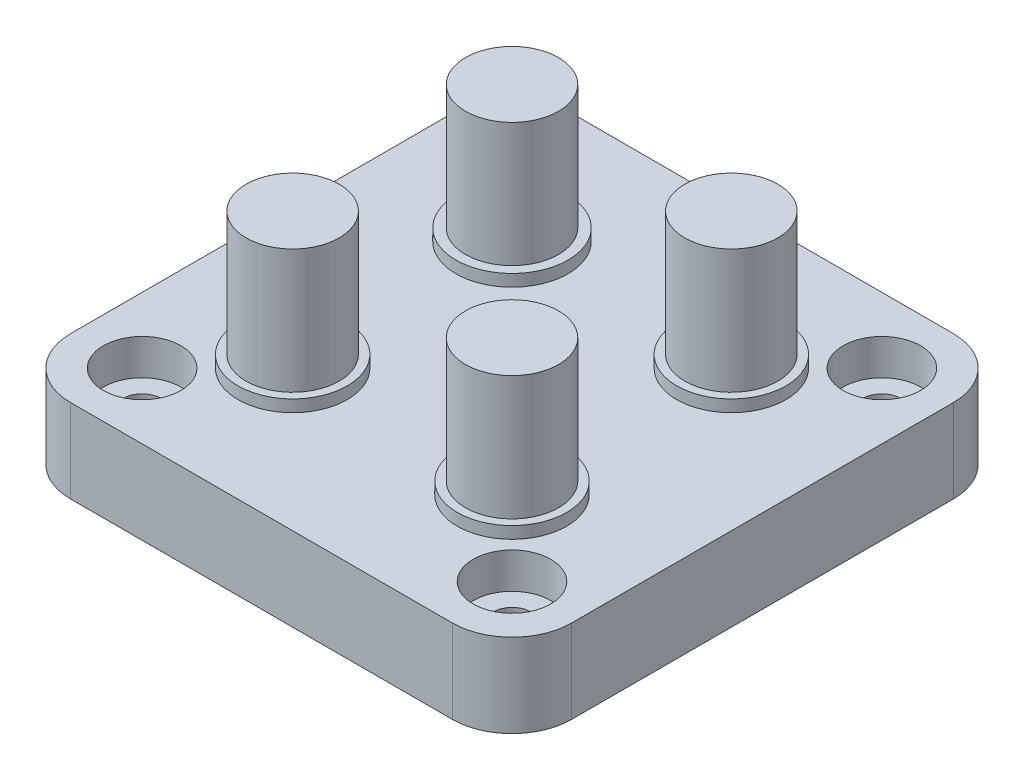
ISO-10303-21;
HEADER;
FILE_DESCRIPTION(('STEP AP214'),'2;1');
FILE_NAME('part.step','',(''),(''),'','','');
FILE_SCHEMA(('AUTOMOTIVE_DESIGN { 1 0 10303 214 1 1 1 1 }'));
ENDSEC;
DATA;
#1=APPLICATION_CONTEXT('core data for automotive mechanical design processes');
#2=APPLICATION_PROTOCOL_DEFINITION('international standard','automotive_design',2000,#1);
#3=PRODUCT_CONTEXT('',#1,'mechanical');
#4=PRODUCT('Part','Part','',(#3));
#5=PRODUCT_RELATED_PRODUCT_CATEGORY('part','',(#4));
#6=PRODUCT_DEFINITION_FORMATION('','',#4);
#7=PRODUCT_DEFINITION_CONTEXT('part definition',#1,'design');
#8=PRODUCT_DEFINITION('design','',#6,#7);
#9=PRODUCT_DEFINITION_SHAPE('','',#8);
#10=(LENGTH_UNIT() NAMED_UNIT(*) SI_UNIT(.MILLI.,.METRE.));
#11=(NAMED_UNIT(*) PLANE_ANGLE_UNIT() SI_UNIT($,.RADIAN.));
#12=(NAMED_UNIT(*) SI_UNIT($,.STERADIAN.) SOLID_ANGLE_UNIT());
#13=UNCERTAINTY_MEASURE_WITH_UNIT(LENGTH_MEASURE(1.E-05),#10,'distance_accuracy_value','');
#14=(GEOMETRIC_REPRESENTATION_CONTEXT(3) GLOBAL_UNCERTAINTY_ASSIGNED_CONTEXT((#13)) GLOBAL_UNIT_ASSIGNED_CONTEXT((#10,
#11,#12)) REPRESENTATION_CONTEXT('',''));
#15=CARTESIAN_POINT('',(0.,0.,0.));
#16=DIRECTION('',(0.,0.,1.));
#17=DIRECTION('',(1.,0.,0.));
#18=AXIS2_PLACEMENT_3D('',#15,#16,#17);
#19=CARTESIAN_POINT('',(5.5,7.,-36.5));
#20=DIRECTION('',(0.,-1.,0.));
#21=DIRECTION('',(0.,0.,-1.));
#22=AXIS2_PLACEMENT_3D('',#19,#20,#21);
#23=CYLINDRICAL_SURFACE('',#22,1.6);
#24=CARTESIAN_POINT('',(5.5,0.,-36.5));
#25=DIRECTION('',(0.,1.,0.));
#26=DIRECTION('',(0.,0.,1.));
#27=AXIS2_PLACEMENT_3D('',#24,#25,#26);
#28=CIRCLE('',#27,1.6);
#29=CARTESIAN_POINT('',(5.5,0.,-34.9));
#30=VERTEX_POINT('',#29);
#31=EDGE_CURVE('E134',#30,#30,#28,.T.);
#32=ORIENTED_EDGE('',*,*,#31,.F.);
#33=EDGE_LOOP('',(#32));
#34=FACE_BOUND('',#33,.T.);
#35=CARTESIAN_POINT('',(5.5,4.,-36.5));
#36=DIRECTION('',(0.,1.,0.));
#37=DIRECTION('',(0.,0.,1.));
#38=AXIS2_PLACEMENT_3D('',#35,#36,#37);
#39=CIRCLE('',#38,1.6);
#40=CARTESIAN_POINT('',(5.5,4.,-34.9));
#41=VERTEX_POINT('',#40);
#42=EDGE_CURVE('E189',#41,#41,#39,.T.);
#43=ORIENTED_EDGE('',*,*,#42,.T.);
#44=EDGE_LOOP('',(#43));
#45=FACE_BOUND('',#44,.T.);
#46=ADVANCED_FACE('F39',(#34,#45),#23,.F.);
#47=CARTESIAN_POINT('',(36.5,7.,-36.5));
#48=DIRECTION('',(0.,-1.,0.));
#49=DIRECTION('',(0.,0.,-1.));
#50=AXIS2_PLACEMENT_3D('',#47,#48,#49);
#51=CYLINDRICAL_SURFACE('',#50,1.6);
#52=CARTESIAN_POINT('',(36.5,0.,-36.5));
#53=DIRECTION('',(0.,1.,0.));
#54=DIRECTION('',(0.,0.,1.));
#55=AXIS2_PLACEMENT_3D('',#52,#53,#54);
#56=CIRCLE('',#55,1.6);
#57=CARTESIAN_POINT('',(36.5,0.,-34.9));
#58=VERTEX_POINT('',#57);
#59=EDGE_CURVE('E140',#58,#58,#56,.T.);
#60=ORIENTED_EDGE('',*,*,#59,.F.);
#61=EDGE_LOOP('',(#60));
#62=FACE_BOUND('',#61,.T.);
#63=CARTESIAN_POINT('',(36.5,4.,-36.5));
#64=DIRECTION('',(0.,1.,0.));
#65=DIRECTION('',(0.,0.,1.));
#66=AXIS2_PLACEMENT_3D('',#63,#64,#65);
#67=CIRCLE('',#66,1.6);
#68=CARTESIAN_POINT('',(36.5,4.,-34.9));
#69=VERTEX_POINT('',#68);
#70=EDGE_CURVE('E186',#69,#69,#67,.T.);
#71=ORIENTED_EDGE('',*,*,#70,.T.);
#72=EDGE_LOOP('',(#71));
#73=FACE_BOUND('',#72,.T.);
#74=ADVANCED_FACE('F311',(#62,#73),#51,.F.);
#75=CARTESIAN_POINT('',(5.5,7.,-5.5));
#76=DIRECTION('',(0.,-1.,0.));
#77=DIRECTION('',(0.,0.,-1.));
#78=AXIS2_PLACEMENT_3D('',#75,#76,#77);
#79=CYLINDRICAL_SURFACE('',#78,1.6);
#80=CARTESIAN_POINT('',(5.5,0.,-5.5));
#81=DIRECTION('',(0.,1.,0.));
#82=DIRECTION('',(0.,0.,1.));
#83=AXIS2_PLACEMENT_3D('',#80,#81,#82);
#84=CIRCLE('',#83,1.6);
#85=CARTESIAN_POINT('',(5.5,0.,-3.9));
#86=VERTEX_POINT('',#85);
#87=EDGE_CURVE('E271',#86,#86,#84,.T.);
#88=ORIENTED_EDGE('',*,*,#87,.F.);
#89=EDGE_LOOP('',(#88));
#90=FACE_BOUND('',#89,.T.);
#91=CARTESIAN_POINT('',(5.5,4.,-5.5));
#92=DIRECTION('',(0.,1.,0.));
#93=DIRECTION('',(0.,0.,1.));
#94=AXIS2_PLACEMENT_3D('',#91,#92,#93);
#95=CIRCLE('',#94,1.6);
#96=CARTESIAN_POINT('',(5.5,4.,-3.9));
#97=VERTEX_POINT('',#96);
#98=EDGE_CURVE('E182',#97,#97,#95,.T.);
#99=ORIENTED_EDGE('',*,*,#98,.T.);
#100=EDGE_LOOP('',(#99));
#101=FACE_BOUND('',#100,.T.);
#102=ADVANCED_FACE('F317',(#90,#101),#79,.F.);
#103=CARTESIAN_POINT('',(36.5,7.,-5.5));
#104=DIRECTION('',(0.,-1.,0.));
#105=DIRECTION('',(0.,0.,-1.));
#106=AXIS2_PLACEMENT_3D('',#103,#104,#105);
#107=CYLINDRICAL_SURFACE('',#106,1.6);
#108=CARTESIAN_POINT('',(36.5,0.,-5.5));
#109=DIRECTION('',(0.,1.,0.));
#110=DIRECTION('',(0.,0.,1.));
#111=AXIS2_PLACEMENT_3D('',#108,#109,#110);
#112=CIRCLE('',#111,1.6);
#113=CARTESIAN_POINT('',(36.5,0.,-3.9));
#114=VERTEX_POINT('',#113);
#115=EDGE_CURVE('E268',#114,#114,#112,.T.);
#116=ORIENTED_EDGE('',*,*,#115,.F.);
#117=EDGE_LOOP('',(#116));
#118=FACE_BOUND('',#117,.T.);
#119=CARTESIAN_POINT('',(36.5,4.,-5.5));
#120=DIRECTION('',(0.,1.,0.));
#121=DIRECTION('',(0.,0.,1.));
#122=AXIS2_PLACEMENT_3D('',#119,#120,#121);
#123=CIRCLE('',#122,1.6);
#124=CARTESIAN_POINT('',(36.5,4.,-3.9));
#125=VERTEX_POINT('',#124);
#126=EDGE_CURVE('E179',#125,#125,#123,.T.);
#127=ORIENTED_EDGE('',*,*,#126,.T.);
#128=EDGE_LOOP('',(#127));
#129=FACE_BOUND('',#128,.T.);
#130=ADVANCED_FACE('F672',(#118,#129),#107,.F.);
#131=CARTESIAN_POINT('',(21.,7.,-21.));
#132=DIRECTION('',(0.,-1.,0.));
#133=DIRECTION('',(0.,0.,-1.));
#134=AXIS2_PLACEMENT_3D('',#131,#132,#133);
#135=CYLINDRICAL_SURFACE('',#134,3.5);
#136=CARTESIAN_POINT('',(21.,7.,-21.));
#137=DIRECTION('',(0.,1.,0.));
#138=DIRECTION('',(0.,0.,1.));
#139=AXIS2_PLACEMENT_3D('',#136,#137,#138);
#140=CIRCLE('',#139,3.5);
#141=CARTESIAN_POINT('',(21.,7.,-17.5));
#142=VERTEX_POINT('',#141);
#143=EDGE_CURVE('E265',#142,#142,#140,.T.);
#144=ORIENTED_EDGE('',*,*,#143,.T.);
#145=EDGE_LOOP('',(#144));
#146=FACE_BOUND('',#145,.T.);
#147=CARTESIAN_POINT('',(21.,3.,-21.));
#148=DIRECTION('',(0.,-1.,0.));
#149=DIRECTION('',(0.,0.,-1.));
#150=AXIS2_PLACEMENT_3D('',#147,#148,#149);
#151=CIRCLE('',#150,3.5);
#152=CARTESIAN_POINT('',(21.,3.,-24.5));
#153=VERTEX_POINT('',#152);
#154=EDGE_CURVE('E174',#153,#153,#151,.T.);
#155=ORIENTED_EDGE('',*,*,#154,.T.);
#156=EDGE_LOOP('',(#155));
#157=FACE_BOUND('',#156,.T.);
#158=ADVANCED_FACE('F326',(#146,#157),#135,.F.);
#159=CARTESIAN_POINT('',(0.,7.,0.));
#160=DIRECTION('',(0.,-1.,0.));
#161=DIRECTION('',(0.,0.,-1.));
#162=AXIS2_PLACEMENT_3D('',#159,#160,#161);
#163=PLANE('',#162);
#164=CARTESIAN_POINT('',(30.1923881554251,7.,-30.1923881554251));
#165=DIRECTION('',(0.,-1.,0.));
#166=DIRECTION('',(0.,0.,-1.));
#167=AXIS2_PLACEMENT_3D('',#164,#165,#166);
#168=CIRCLE('',#167,4.58049526414542);
#169=CARTESIAN_POINT('',(30.1923881554251,7.,-34.7728834195705));
#170=VERTEX_POINT('',#169);
#171=EDGE_CURVE('E11',#170,#170,#168,.F.);
#172=ORIENTED_EDGE('',*,*,#171,.F.);
#173=EDGE_LOOP('',(#172));
#174=FACE_BOUND('',#173,.T.);
#175=CARTESIAN_POINT('',(30.1923881554251,7.,-11.8076118445749));
#176=DIRECTION('',(0.,-1.,0.));
#177=DIRECTION('',(0.,0.,-1.));
#178=AXIS2_PLACEMENT_3D('',#175,#176,#177);
#179=CIRCLE('',#178,4.58049526414542);
#180=CARTESIAN_POINT('',(30.1923881554251,7.,-16.3881071087203));
#181=VERTEX_POINT('',#180);
#182=EDGE_CURVE('E47',#181,#181,#179,.F.);
#183=ORIENTED_EDGE('',*,*,#182,.F.);
#184=EDGE_LOOP('',(#183));
#185=FACE_BOUND('',#184,.T.);
#186=CARTESIAN_POINT('',(11.8076118445749,7.,-11.8076118445749));
#187=DIRECTION('',(0.,-1.,0.));
#188=DIRECTION('',(0.,0.,-1.));
#189=AXIS2_PLACEMENT_3D('',#186,#187,#188);
#190=CIRCLE('',#189,4.58049526414542);
#191=CARTESIAN_POINT('',(11.8076118445749,7.,-16.3881071087203));
#192=VERTEX_POINT('',#191);
#193=EDGE_CURVE('E200',#192,#192,#190,.F.);
#194=ORIENTED_EDGE('',*,*,#193,.F.);
#195=EDGE_LOOP('',(#194));
#196=FACE_BOUND('',#195,.T.);
#197=CARTESIAN_POINT('',(11.8076118445749,7.,-30.1923881554251));
#198=DIRECTION('',(0.,-1.,0.));
#199=DIRECTION('',(0.,0.,-1.));
#200=AXIS2_PLACEMENT_3D('',#197,#198,#199);
#201=CIRCLE('',#200,4.7);
#202=CARTESIAN_POINT('',(11.8076118445749,7.,-34.8923881554251));
#203=VERTEX_POINT('',#202);
#204=EDGE_CURVE('E173',#203,#203,#201,.F.);
#205=ORIENTED_EDGE('',*,*,#204,.F.);
#206=EDGE_LOOP('',(#205));
#207=FACE_BOUND('',#206,.T.);
#208=CARTESIAN_POINT('',(36.5,7.,-36.5));
#209=DIRECTION('',(0.,1.,0.));
#210=DIRECTION('',(0.,0.,1.));
#211=AXIS2_PLACEMENT_3D('',#208,#209,#210);
#212=CIRCLE('',#211,3.25);
#213=CARTESIAN_POINT('',(36.5,7.,-33.25));
#214=VERTEX_POINT('',#213);
#215=EDGE_CURVE('E234',#214,#214,#212,.T.);
#216=ORIENTED_EDGE('',*,*,#215,.F.);
#217=EDGE_LOOP('',(#216));
#218=FACE_BOUND('',#217,.T.);
#219=CARTESIAN_POINT('',(5.5,7.,-5.5));
#220=DIRECTION('',(0.,1.,0.));
#221=DIRECTION('',(0.,0.,1.));
#222=AXIS2_PLACEMENT_3D('',#219,#220,#221);
#223=CIRCLE('',#222,3.25);
#224=CARTESIAN_POINT('',(5.5,7.,-2.25));
#225=VERTEX_POINT('',#224);
#226=EDGE_CURVE('E241',#225,#225,#223,.T.);
#227=ORIENTED_EDGE('',*,*,#226,.F.);
#228=EDGE_LOOP('',(#227));
#229=FACE_BOUND('',#228,.T.);
#230=CARTESIAN_POINT('',(36.5,7.,-5.5));
#231=DIRECTION('',(0.,1.,0.));
#232=DIRECTION('',(0.,0.,1.));
#233=AXIS2_PLACEMENT_3D('',#230,#231,#232);
#234=CIRCLE('',#233,3.25);
#235=CARTESIAN_POINT('',(36.5,7.,-2.25));
#236=VERTEX_POINT('',#235);
#237=EDGE_CURVE('E228',#236,#236,#234,.T.);
#238=ORIENTED_EDGE('',*,*,#237,.F.);
#239=EDGE_LOOP('',(#238));
#240=FACE_BOUND('',#239,.T.);
#241=CARTESIAN_POINT('',(5.5,7.,-36.5));
#242=DIRECTION('',(0.,1.,0.));
#243=DIRECTION('',(0.,0.,1.));
#244=AXIS2_PLACEMENT_3D('',#241,#242,#243);
#245=CIRCLE('',#244,3.25);
#246=CARTESIAN_POINT('',(5.5,7.,-33.25));
#247=VERTEX_POINT('',#246);
#248=EDGE_CURVE('E237',#247,#247,#245,.T.);
#249=ORIENTED_EDGE('',*,*,#248,.F.);
#250=EDGE_LOOP('',(#249));
#251=FACE_BOUND('',#250,.T.);
#252=DIRECTION('',(-1.,0.,0.));
#253=VECTOR('',#252,1.);
#254=CARTESIAN_POINT('',(0.,7.,-42.));
#255=LINE('',#254,#253);
#256=CARTESIAN_POINT('',(37.,7.,-42.));
#257=VERTEX_POINT('',#256);
#258=CARTESIAN_POINT('',(5.,7.,-42.));
#259=VERTEX_POINT('',#258);
#260=EDGE_CURVE('E143',#257,#259,#255,.T.);
#261=ORIENTED_EDGE('',*,*,#260,.T.);
#262=CARTESIAN_POINT('',(5.,7.,-37.));
#263=DIRECTION('',(0.,-1.,0.));
#264=DIRECTION('',(0.,0.,-1.));
#265=AXIS2_PLACEMENT_3D('',#262,#263,#264);
#266=CIRCLE('',#265,5.);
#267=CARTESIAN_POINT('',(0.,7.,-37.));
#268=VERTEX_POINT('',#267);
#269=EDGE_CURVE('E162',#259,#268,#266,.F.);
#270=ORIENTED_EDGE('',*,*,#269,.T.);
#271=DIRECTION('',(0.,0.,1.));
#272=VECTOR('',#271,1.);
#273=CARTESIAN_POINT('',(0.,7.,0.));
#274=LINE('',#273,#272);
#275=CARTESIAN_POINT('',(0.,7.,-5.));
#276=VERTEX_POINT('',#275);
#277=EDGE_CURVE('E126',#268,#276,#274,.T.);
#278=ORIENTED_EDGE('',*,*,#277,.T.);
#279=CARTESIAN_POINT('',(5.,7.,-5.));
#280=DIRECTION('',(0.,-1.,0.));
#281=DIRECTION('',(0.,0.,-1.));
#282=AXIS2_PLACEMENT_3D('',#279,#280,#281);
#283=CIRCLE('',#282,5.);
#284=CARTESIAN_POINT('',(5.,7.,0.));
#285=VERTEX_POINT('',#284);
#286=EDGE_CURVE('E157',#276,#285,#283,.F.);
#287=ORIENTED_EDGE('',*,*,#286,.T.);
#288=DIRECTION('',(1.,0.,0.));
#289=VECTOR('',#288,1.);
#290=CARTESIAN_POINT('',(0.,7.,0.));
#291=LINE('',#290,#289);
#292=CARTESIAN_POINT('',(37.,7.,0.));
#293=VERTEX_POINT('',#292);
#294=EDGE_CURVE('E277',#285,#293,#291,.T.);
#295=ORIENTED_EDGE('',*,*,#294,.T.);
#296=CARTESIAN_POINT('',(37.,7.,-5.));
#297=DIRECTION('',(0.,-1.,0.));
#298=DIRECTION('',(0.,0.,-1.));
#299=AXIS2_PLACEMENT_3D('',#296,#297,#298);
#300=CIRCLE('',#299,5.);
#301=CARTESIAN_POINT('',(42.,7.,-5.));
#302=VERTEX_POINT('',#301);
#303=EDGE_CURVE('E61',#293,#302,#300,.F.);
#304=ORIENTED_EDGE('',*,*,#303,.T.);
#305=DIRECTION('',(0.,0.,-1.));
#306=VECTOR('',#305,1.);
#307=CARTESIAN_POINT('',(42.,7.,0.));
#308=LINE('',#307,#306);
#309=CARTESIAN_POINT('',(42.,7.,-37.));
#310=VERTEX_POINT('',#309);
#311=EDGE_CURVE('E278',#302,#310,#308,.T.);
#312=ORIENTED_EDGE('',*,*,#311,.T.);
#313=CARTESIAN_POINT('',(37.,7.,-37.));
#314=DIRECTION('',(0.,-1.,0.));
#315=DIRECTION('',(0.,0.,-1.));
#316=AXIS2_PLACEMENT_3D('',#313,#314,#315);
#317=CIRCLE('',#316,5.);
#318=EDGE_CURVE('E160',#310,#257,#317,.F.);
#319=ORIENTED_EDGE('',*,*,#318,.T.);
#320=EDGE_LOOP('',(#261,#270,#278,#287,#295,#304,#312,#319));
#321=FACE_BOUND('',#320,.T.);
#322=ORIENTED_EDGE('',*,*,#143,.F.);
#323=EDGE_LOOP('',(#322));
#324=FACE_BOUND('',#323,.T.);
#325=ADVANCED_FACE('F282',(#174,#185,#196,#207,#218,#229,#240,#251,#321,#324),#163,.F.);
#326=CARTESIAN_POINT('',(0.,0.,0.));
#327=DIRECTION('',(0.,-1.,0.));
#328=DIRECTION('',(0.,0.,-1.));
#329=AXIS2_PLACEMENT_3D('',#326,#327,#328);
#330=PLANE('',#329);
#331=CARTESIAN_POINT('',(21.,0.,-21.));
#332=DIRECTION('',(0.,-1.,0.));
#333=DIRECTION('',(0.,0.,-1.));
#334=AXIS2_PLACEMENT_3D('',#331,#332,#333);
#335=CIRCLE('',#334,12.);
#336=CARTESIAN_POINT('',(21.,0.,-33.));
#337=VERTEX_POINT('',#336);
#338=EDGE_CURVE('E192',#337,#337,#335,.T.);
#339=ORIENTED_EDGE('',*,*,#338,.F.);
#340=EDGE_LOOP('',(#339));
#341=FACE_BOUND('',#340,.T.);
#342=ORIENTED_EDGE('',*,*,#115,.T.);
#343=EDGE_LOOP('',(#342));
#344=FACE_BOUND('',#343,.T.);
#345=ORIENTED_EDGE('',*,*,#59,.T.);
#346=EDGE_LOOP('',(#345));
#347=FACE_BOUND('',#346,.T.);
#348=DIRECTION('',(0.,0.,1.));
#349=VECTOR('',#348,1.);
#350=CARTESIAN_POINT('',(0.,0.,0.));
#351=LINE('',#350,#349);
#352=CARTESIAN_POINT('',(0.,0.,-37.));
#353=VERTEX_POINT('',#352);
#354=CARTESIAN_POINT('',(0.,0.,-5.));
#355=VERTEX_POINT('',#354);
#356=EDGE_CURVE('E123',#353,#355,#351,.T.);
#357=ORIENTED_EDGE('',*,*,#356,.F.);
#358=CARTESIAN_POINT('',(5.,0.,-37.));
#359=DIRECTION('',(0.,-1.,0.));
#360=DIRECTION('',(0.,0.,-1.));
#361=AXIS2_PLACEMENT_3D('',#358,#359,#360);
#362=CIRCLE('',#361,5.);
#363=CARTESIAN_POINT('',(5.,0.,-42.));
#364=VERTEX_POINT('',#363);
#365=EDGE_CURVE('E106',#353,#364,#362,.T.);
#366=ORIENTED_EDGE('',*,*,#365,.T.);
#367=DIRECTION('',(-1.,0.,0.));
#368=VECTOR('',#367,1.);
#369=CARTESIAN_POINT('',(0.,0.,-42.));
#370=LINE('',#369,#368);
#371=CARTESIAN_POINT('',(37.,0.,-42.));
#372=VERTEX_POINT('',#371);
#373=EDGE_CURVE('E147',#372,#364,#370,.T.);
#374=ORIENTED_EDGE('',*,*,#373,.F.);
#375=CARTESIAN_POINT('',(37.,0.,-37.));
#376=DIRECTION('',(0.,-1.,0.));
#377=DIRECTION('',(0.,0.,-1.));
#378=AXIS2_PLACEMENT_3D('',#375,#376,#377);
#379=CIRCLE('',#378,5.);
#380=CARTESIAN_POINT('',(42.,0.,-37.));
#381=VERTEX_POINT('',#380);
#382=EDGE_CURVE('E117',#372,#381,#379,.T.);
#383=ORIENTED_EDGE('',*,*,#382,.T.);
#384=DIRECTION('',(0.,0.,-1.));
#385=VECTOR('',#384,1.);
#386=CARTESIAN_POINT('',(42.,0.,0.));
#387=LINE('',#386,#385);
#388=CARTESIAN_POINT('',(42.,0.,-5.));
#389=VERTEX_POINT('',#388);
#390=EDGE_CURVE('E137',#389,#381,#387,.T.);
#391=ORIENTED_EDGE('',*,*,#390,.F.);
#392=CARTESIAN_POINT('',(37.,0.,-5.));
#393=DIRECTION('',(0.,-1.,0.));
#394=DIRECTION('',(0.,0.,-1.));
#395=AXIS2_PLACEMENT_3D('',#392,#393,#394);
#396=CIRCLE('',#395,5.);
#397=CARTESIAN_POINT('',(37.,0.,0.));
#398=VERTEX_POINT('',#397);
#399=EDGE_CURVE('E151',#389,#398,#396,.T.);
#400=ORIENTED_EDGE('',*,*,#399,.T.);
#401=DIRECTION('',(1.,0.,0.));
#402=VECTOR('',#401,1.);
#403=CARTESIAN_POINT('',(0.,0.,0.));
#404=LINE('',#403,#402);
#405=CARTESIAN_POINT('',(5.,0.,0.));
#406=VERTEX_POINT('',#405);
#407=EDGE_CURVE('E133',#406,#398,#404,.T.);
#408=ORIENTED_EDGE('',*,*,#407,.F.);
#409=CARTESIAN_POINT('',(5.,0.,-5.));
#410=DIRECTION('',(0.,-1.,0.));
#411=DIRECTION('',(0.,0.,-1.));
#412=AXIS2_PLACEMENT_3D('',#409,#410,#411);
#413=CIRCLE('',#412,5.);
#414=EDGE_CURVE('E127',#406,#355,#413,.T.);
#415=ORIENTED_EDGE('',*,*,#414,.T.);
#416=EDGE_LOOP('',(#357,#366,#374,#383,#391,#400,#408,#415));
#417=FACE_BOUND('',#416,.T.);
#418=ORIENTED_EDGE('',*,*,#31,.T.);
#419=EDGE_LOOP('',(#418));
#420=FACE_BOUND('',#419,.T.);
#421=ORIENTED_EDGE('',*,*,#87,.T.);
#422=EDGE_LOOP('',(#421));
#423=FACE_BOUND('',#422,.T.);
#424=ADVANCED_FACE('F130',(#341,#344,#347,#417,#420,#423),#330,.T.);
#425=CARTESIAN_POINT('',(0.,7.,0.));
#426=DIRECTION('',(1.,0.,0.));
#427=DIRECTION('',(0.,0.,-1.));
#428=AXIS2_PLACEMENT_3D('',#425,#426,#427);
#429=PLANE('',#428);
#430=ORIENTED_EDGE('',*,*,#277,.F.);
#431=DIRECTION('',(0.,-1.,0.));
#432=VECTOR('',#431,1.);
#433=CARTESIAN_POINT('',(0.,7.,-37.));
#434=LINE('',#433,#432);
#435=EDGE_CURVE('E110',#268,#353,#434,.T.);
#436=ORIENTED_EDGE('',*,*,#435,.T.);
#437=ORIENTED_EDGE('',*,*,#356,.T.);
#438=DIRECTION('',(0.,-1.,0.));
#439=VECTOR('',#438,1.);
#440=CARTESIAN_POINT('',(0.,7.,-5.));
#441=LINE('',#440,#439);
#442=EDGE_CURVE('E128',#355,#276,#441,.F.);
#443=ORIENTED_EDGE('',*,*,#442,.T.);
#444=EDGE_LOOP('',(#430,#436,#437,#443));
#445=FACE_BOUND('',#444,.T.);
#446=ADVANCED_FACE('F122',(#445),#429,.F.);
#447=CARTESIAN_POINT('',(0.,7.,0.));
#448=DIRECTION('',(0.,0.,-1.));
#449=DIRECTION('',(-1.,0.,0.));
#450=AXIS2_PLACEMENT_3D('',#447,#448,#449);
#451=PLANE('',#450);
#452=ORIENTED_EDGE('',*,*,#407,.T.);
#453=DIRECTION('',(0.,-1.,0.));
#454=VECTOR('',#453,1.);
#455=CARTESIAN_POINT('',(37.,7.,0.));
#456=LINE('',#455,#454);
#457=EDGE_CURVE('E171',#398,#293,#456,.F.);
#458=ORIENTED_EDGE('',*,*,#457,.T.);
#459=ORIENTED_EDGE('',*,*,#294,.F.);
#460=DIRECTION('',(0.,-1.,0.));
#461=VECTOR('',#460,1.);
#462=CARTESIAN_POINT('',(5.,7.,0.));
#463=LINE('',#462,#461);
#464=EDGE_CURVE('E168',#285,#406,#463,.T.);
#465=ORIENTED_EDGE('',*,*,#464,.T.);
#466=EDGE_LOOP('',(#452,#458,#459,#465));
#467=FACE_BOUND('',#466,.T.);
#468=ADVANCED_FACE('F296',(#467),#451,.F.);
#469=CARTESIAN_POINT('',(42.,7.,0.));
#470=DIRECTION('',(-1.,0.,0.));
#471=DIRECTION('',(0.,0.,1.));
#472=AXIS2_PLACEMENT_3D('',#469,#470,#471);
#473=PLANE('',#472);
#474=ORIENTED_EDGE('',*,*,#390,.T.);
#475=DIRECTION('',(0.,-1.,0.));
#476=VECTOR('',#475,1.);
#477=CARTESIAN_POINT('',(42.,7.,-37.));
#478=LINE('',#477,#476);
#479=EDGE_CURVE('E54',#381,#310,#478,.F.);
#480=ORIENTED_EDGE('',*,*,#479,.T.);
#481=ORIENTED_EDGE('',*,*,#311,.F.);
#482=DIRECTION('',(0.,-1.,0.));
#483=VECTOR('',#482,1.);
#484=CARTESIAN_POINT('',(42.,7.,-5.));
#485=LINE('',#484,#483);
#486=EDGE_CURVE('E164',#302,#389,#485,.T.);
#487=ORIENTED_EDGE('',*,*,#486,.T.);
#488=EDGE_LOOP('',(#474,#480,#481,#487));
#489=FACE_BOUND('',#488,.T.);
#490=ADVANCED_FACE('F290',(#489),#473,.F.);
#491=CARTESIAN_POINT('',(0.,7.,-42.));
#492=DIRECTION('',(0.,0.,1.));
#493=DIRECTION('',(1.,0.,0.));
#494=AXIS2_PLACEMENT_3D('',#491,#492,#493);
#495=PLANE('',#494);
#496=ORIENTED_EDGE('',*,*,#373,.T.);
#497=DIRECTION('',(0.,-1.,0.));
#498=VECTOR('',#497,1.);
#499=CARTESIAN_POINT('',(5.,7.,-42.));
#500=LINE('',#499,#498);
#501=EDGE_CURVE('E111',#364,#259,#500,.F.);
#502=ORIENTED_EDGE('',*,*,#501,.T.);
#503=ORIENTED_EDGE('',*,*,#260,.F.);
#504=DIRECTION('',(0.,-1.,0.));
#505=VECTOR('',#504,1.);
#506=CARTESIAN_POINT('',(37.,7.,-42.));
#507=LINE('',#506,#505);
#508=EDGE_CURVE('E116',#257,#372,#507,.T.);
#509=ORIENTED_EDGE('',*,*,#508,.T.);
#510=EDGE_LOOP('',(#496,#502,#503,#509));
#511=FACE_BOUND('',#510,.T.);
#512=ADVANCED_FACE('F286',(#511),#495,.F.);
#513=CARTESIAN_POINT('',(5.,7.,-37.));
#514=DIRECTION('',(0.,-1.,0.));
#515=DIRECTION('',(0.,0.,-1.));
#516=AXIS2_PLACEMENT_3D('',#513,#514,#515);
#517=CYLINDRICAL_SURFACE('',#516,5.);
#518=ORIENTED_EDGE('',*,*,#269,.F.);
#519=ORIENTED_EDGE('',*,*,#501,.F.);
#520=ORIENTED_EDGE('',*,*,#365,.F.);
#521=ORIENTED_EDGE('',*,*,#435,.F.);
#522=EDGE_LOOP('',(#518,#519,#520,#521));
#523=FACE_BOUND('',#522,.T.);
#524=ADVANCED_FACE('F109',(#523),#517,.T.);
#525=CARTESIAN_POINT('',(37.,7.,-37.));
#526=DIRECTION('',(0.,-1.,0.));
#527=DIRECTION('',(0.,0.,-1.));
#528=AXIS2_PLACEMENT_3D('',#525,#526,#527);
#529=CYLINDRICAL_SURFACE('',#528,5.);
#530=ORIENTED_EDGE('',*,*,#318,.F.);
#531=ORIENTED_EDGE('',*,*,#479,.F.);
#532=ORIENTED_EDGE('',*,*,#382,.F.);
#533=ORIENTED_EDGE('',*,*,#508,.F.);
#534=EDGE_LOOP('',(#530,#531,#532,#533));
#535=FACE_BOUND('',#534,.T.);
#536=ADVANCED_FACE('F288',(#535),#529,.T.);
#537=CARTESIAN_POINT('',(37.,7.,-5.));
#538=DIRECTION('',(0.,-1.,0.));
#539=DIRECTION('',(0.,0.,-1.));
#540=AXIS2_PLACEMENT_3D('',#537,#538,#539);
#541=CYLINDRICAL_SURFACE('',#540,5.);
#542=ORIENTED_EDGE('',*,*,#303,.F.);
#543=ORIENTED_EDGE('',*,*,#457,.F.);
#544=ORIENTED_EDGE('',*,*,#399,.F.);
#545=ORIENTED_EDGE('',*,*,#486,.F.);
#546=EDGE_LOOP('',(#542,#543,#544,#545));
#547=FACE_BOUND('',#546,.T.);
#548=ADVANCED_FACE('F293',(#547),#541,.T.);
#549=CARTESIAN_POINT('',(5.,7.,-5.));
#550=DIRECTION('',(0.,-1.,0.));
#551=DIRECTION('',(0.,0.,-1.));
#552=AXIS2_PLACEMENT_3D('',#549,#550,#551);
#553=CYLINDRICAL_SURFACE('',#552,5.);
#554=ORIENTED_EDGE('',*,*,#286,.F.);
#555=ORIENTED_EDGE('',*,*,#442,.F.);
#556=ORIENTED_EDGE('',*,*,#414,.F.);
#557=ORIENTED_EDGE('',*,*,#464,.F.);
#558=EDGE_LOOP('',(#554,#555,#556,#557));
#559=FACE_BOUND('',#558,.T.);
#560=ADVANCED_FACE('F41',(#559),#553,.T.);
#561=CARTESIAN_POINT('',(21.,3.,-21.));
#562=DIRECTION('',(0.,-1.,0.));
#563=DIRECTION('',(0.,0.,-1.));
#564=AXIS2_PLACEMENT_3D('',#561,#562,#563);
#565=CYLINDRICAL_SURFACE('',#564,12.);
#566=CARTESIAN_POINT('',(21.,3.,-21.));
#567=DIRECTION('',(0.,-1.,0.));
#568=DIRECTION('',(0.,0.,-1.));
#569=AXIS2_PLACEMENT_3D('',#566,#567,#568);
#570=CIRCLE('',#569,12.);
#571=CARTESIAN_POINT('',(21.,3.,-33.));
#572=VERTEX_POINT('',#571);
#573=EDGE_CURVE('E178',#572,#572,#570,.T.);
#574=ORIENTED_EDGE('',*,*,#573,.F.);
#575=EDGE_LOOP('',(#574));
#576=FACE_BOUND('',#575,.T.);
#577=ORIENTED_EDGE('',*,*,#338,.T.);
#578=EDGE_LOOP('',(#577));
#579=FACE_BOUND('',#578,.T.);
#580=ADVANCED_FACE('F302',(#576,#579),#565,.F.);
#581=CARTESIAN_POINT('',(21.,3.,-21.));
#582=DIRECTION('',(0.,-1.,0.));
#583=DIRECTION('',(0.,0.,-1.));
#584=AXIS2_PLACEMENT_3D('',#581,#582,#583);
#585=PLANE('',#584);
#586=ORIENTED_EDGE('',*,*,#154,.F.);
#587=EDGE_LOOP('',(#586));
#588=FACE_BOUND('',#587,.T.);
#589=ORIENTED_EDGE('',*,*,#573,.T.);
#590=EDGE_LOOP('',(#589));
#591=FACE_BOUND('',#590,.T.);
#592=ADVANCED_FACE('F307',(#588,#591),#585,.T.);
#593=CARTESIAN_POINT('',(36.5,4.,-5.5));
#594=DIRECTION('',(0.,1.,0.));
#595=DIRECTION('',(0.,0.,1.));
#596=AXIS2_PLACEMENT_3D('',#593,#594,#595);
#597=CYLINDRICAL_SURFACE('',#596,3.25);
#598=CARTESIAN_POINT('',(36.5,4.,-5.5));
#599=DIRECTION('',(0.,1.,0.));
#600=DIRECTION('',(0.,0.,1.));
#601=AXIS2_PLACEMENT_3D('',#598,#599,#600);
#602=CIRCLE('',#601,3.25);
#603=CARTESIAN_POINT('',(36.5,4.,-2.25));
#604=VERTEX_POINT('',#603);
#605=EDGE_CURVE('E196',#604,#604,#602,.T.);
#606=ORIENTED_EDGE('',*,*,#605,.F.);
#607=EDGE_LOOP('',(#606));
#608=FACE_BOUND('',#607,.T.);
#609=ORIENTED_EDGE('',*,*,#237,.T.);
#610=EDGE_LOOP('',(#609));
#611=FACE_BOUND('',#610,.T.);
#612=ADVANCED_FACE('F371',(#608,#611),#597,.F.);
#613=CARTESIAN_POINT('',(36.5,4.,-5.5));
#614=DIRECTION('',(0.,1.,0.));
#615=DIRECTION('',(0.,0.,1.));
#616=AXIS2_PLACEMENT_3D('',#613,#614,#615);
#617=PLANE('',#616);
#618=ORIENTED_EDGE('',*,*,#126,.F.);
#619=EDGE_LOOP('',(#618));
#620=FACE_BOUND('',#619,.T.);
#621=ORIENTED_EDGE('',*,*,#605,.T.);
#622=EDGE_LOOP('',(#621));
#623=FACE_BOUND('',#622,.T.);
#624=ADVANCED_FACE('F382',(#620,#623),#617,.T.);
#625=CARTESIAN_POINT('',(5.5,4.,-5.5));
#626=DIRECTION('',(0.,1.,0.));
#627=DIRECTION('',(0.,0.,1.));
#628=AXIS2_PLACEMENT_3D('',#625,#626,#627);
#629=CYLINDRICAL_SURFACE('',#628,3.25);
#630=CARTESIAN_POINT('',(5.5,4.,-5.5));
#631=DIRECTION('',(0.,1.,0.));
#632=DIRECTION('',(0.,0.,1.));
#633=AXIS2_PLACEMENT_3D('',#630,#631,#632);
#634=CIRCLE('',#633,3.25);
#635=CARTESIAN_POINT('',(5.5,4.,-2.25));
#636=VERTEX_POINT('',#635);
#637=EDGE_CURVE('E231',#636,#636,#634,.T.);
#638=ORIENTED_EDGE('',*,*,#637,.F.);
#639=EDGE_LOOP('',(#638));
#640=FACE_BOUND('',#639,.T.);
#641=ORIENTED_EDGE('',*,*,#226,.T.);
#642=EDGE_LOOP('',(#641));
#643=FACE_BOUND('',#642,.T.);
#644=ADVANCED_FACE('F393',(#640,#643),#629,.F.);
#645=CARTESIAN_POINT('',(5.5,4.,-5.5));
#646=DIRECTION('',(0.,1.,0.));
#647=DIRECTION('',(0.,0.,1.));
#648=AXIS2_PLACEMENT_3D('',#645,#646,#647);
#649=PLANE('',#648);
#650=ORIENTED_EDGE('',*,*,#98,.F.);
#651=EDGE_LOOP('',(#650));
#652=FACE_BOUND('',#651,.T.);
#653=ORIENTED_EDGE('',*,*,#637,.T.);
#654=EDGE_LOOP('',(#653));
#655=FACE_BOUND('',#654,.T.);
#656=ADVANCED_FACE('F403',(#652,#655),#649,.T.);
#657=CARTESIAN_POINT('',(36.5,4.,-36.5));
#658=DIRECTION('',(0.,1.,0.));
#659=DIRECTION('',(0.,0.,1.));
#660=AXIS2_PLACEMENT_3D('',#657,#658,#659);
#661=CYLINDRICAL_SURFACE('',#660,3.25);
#662=CARTESIAN_POINT('',(36.5,4.,-36.5));
#663=DIRECTION('',(0.,1.,0.));
#664=DIRECTION('',(0.,0.,1.));
#665=AXIS2_PLACEMENT_3D('',#662,#663,#664);
#666=CIRCLE('',#665,3.25);
#667=CARTESIAN_POINT('',(36.5,4.,-33.25));
#668=VERTEX_POINT('',#667);
#669=EDGE_CURVE('E238',#668,#668,#666,.T.);
#670=ORIENTED_EDGE('',*,*,#669,.F.);
#671=EDGE_LOOP('',(#670));
#672=FACE_BOUND('',#671,.T.);
#673=ORIENTED_EDGE('',*,*,#215,.T.);
#674=EDGE_LOOP('',(#673));
#675=FACE_BOUND('',#674,.T.);
#676=ADVANCED_FACE('F413',(#672,#675),#661,.F.);
#677=CARTESIAN_POINT('',(36.5,4.,-36.5));
#678=DIRECTION('',(0.,1.,0.));
#679=DIRECTION('',(0.,0.,1.));
#680=AXIS2_PLACEMENT_3D('',#677,#678,#679);
#681=PLANE('',#680);
#682=ORIENTED_EDGE('',*,*,#70,.F.);
#683=EDGE_LOOP('',(#682));
#684=FACE_BOUND('',#683,.T.);
#685=ORIENTED_EDGE('',*,*,#669,.T.);
#686=EDGE_LOOP('',(#685));
#687=FACE_BOUND('',#686,.T.);
#688=ADVANCED_FACE('F423',(#684,#687),#681,.T.);
#689=CARTESIAN_POINT('',(5.5,4.,-36.5));
#690=DIRECTION('',(0.,1.,0.));
#691=DIRECTION('',(0.,0.,1.));
#692=AXIS2_PLACEMENT_3D('',#689,#690,#691);
#693=CYLINDRICAL_SURFACE('',#692,3.25);
#694=CARTESIAN_POINT('',(5.5,4.,-36.5));
#695=DIRECTION('',(0.,1.,0.));
#696=DIRECTION('',(0.,0.,1.));
#697=AXIS2_PLACEMENT_3D('',#694,#695,#696);
#698=CIRCLE('',#697,3.25);
#699=CARTESIAN_POINT('',(5.5,4.,-33.25));
#700=VERTEX_POINT('',#699);
#701=EDGE_CURVE('E183',#700,#700,#698,.T.);
#702=ORIENTED_EDGE('',*,*,#701,.F.);
#703=EDGE_LOOP('',(#702));
#704=FACE_BOUND('',#703,.T.);
#705=ORIENTED_EDGE('',*,*,#248,.T.);
#706=EDGE_LOOP('',(#705));
#707=FACE_BOUND('',#706,.T.);
#708=ADVANCED_FACE('F433',(#704,#707),#693,.F.);
#709=CARTESIAN_POINT('',(5.5,4.,-36.5));
#710=DIRECTION('',(0.,1.,0.));
#711=DIRECTION('',(0.,0.,1.));
#712=AXIS2_PLACEMENT_3D('',#709,#710,#711);
#713=PLANE('',#712);
#714=ORIENTED_EDGE('',*,*,#42,.F.);
#715=EDGE_LOOP('',(#714));
#716=FACE_BOUND('',#715,.T.);
#717=ORIENTED_EDGE('',*,*,#701,.T.);
#718=EDGE_LOOP('',(#717));
#719=FACE_BOUND('',#718,.T.);
#720=ADVANCED_FACE('F443',(#716,#719),#713,.T.);
#721=CARTESIAN_POINT('',(11.8076118445749,8.,-30.1923881554251));
#722=DIRECTION('',(0.,-1.,0.));
#723=DIRECTION('',(0.,0.,-1.));
#724=AXIS2_PLACEMENT_3D('',#721,#722,#723);
#725=CYLINDRICAL_SURFACE('',#724,4.7);
#726=CARTESIAN_POINT('',(11.8076118445749,8.,-30.1923881554251));
#727=DIRECTION('',(0.,1.,0.));
#728=DIRECTION('',(0.,0.,1.));
#729=AXIS2_PLACEMENT_3D('',#726,#727,#728);
#730=CIRCLE('',#729,4.7);
#731=CARTESIAN_POINT('',(11.8076118445749,8.,-25.4923881554251));
#732=VERTEX_POINT('',#731);
#733=EDGE_CURVE('E197',#732,#732,#730,.T.);
#734=ORIENTED_EDGE('',*,*,#733,.F.);
#735=EDGE_LOOP('',(#734));
#736=FACE_BOUND('',#735,.T.);
#737=ORIENTED_EDGE('',*,*,#204,.T.);
#738=EDGE_LOOP('',(#737));
#739=FACE_BOUND('',#738,.T.);
#740=ADVANCED_FACE('F453',(#736,#739),#725,.T.);
#741=CARTESIAN_POINT('',(11.8076118445749,8.,-30.1923881554251));
#742=DIRECTION('',(0.,1.,0.));
#743=DIRECTION('',(0.,0.,1.));
#744=AXIS2_PLACEMENT_3D('',#741,#742,#743);
#745=PLANE('',#744);
#746=CARTESIAN_POINT('',(11.8076118445749,8.,-30.1923881554251));
#747=DIRECTION('',(0.,1.,0.));
#748=DIRECTION('',(0.,0.,1.));
#749=AXIS2_PLACEMENT_3D('',#746,#747,#748);
#750=CIRCLE('',#749,3.9);
#751=CARTESIAN_POINT('',(11.8076118445749,8.,-26.2923881554251));
#752=VERTEX_POINT('',#751);
#753=EDGE_CURVE('E193',#752,#752,#750,.T.);
#754=ORIENTED_EDGE('',*,*,#753,.F.);
#755=EDGE_LOOP('',(#754));
#756=FACE_BOUND('',#755,.T.);
#757=ORIENTED_EDGE('',*,*,#733,.T.);
#758=EDGE_LOOP('',(#757));
#759=FACE_BOUND('',#758,.T.);
#760=ADVANCED_FACE('F464',(#756,#759),#745,.T.);
#761=CARTESIAN_POINT('',(11.8076118445749,18.4,-30.1923881554251));
#762=DIRECTION('',(0.,1.,0.));
#763=DIRECTION('',(0.,0.,1.));
#764=AXIS2_PLACEMENT_3D('',#761,#762,#763);
#765=PLANE('',#764);
#766=CARTESIAN_POINT('',(11.8076118445749,18.4,-30.1923881554251));
#767=DIRECTION('',(0.,1.,0.));
#768=DIRECTION('',(0.,0.,1.));
#769=AXIS2_PLACEMENT_3D('',#766,#767,#768);
#770=CIRCLE('',#769,3.9);
#771=CARTESIAN_POINT('',(11.8076118445749,18.4,-26.2923881554251));
#772=VERTEX_POINT('',#771);
#773=EDGE_CURVE('E262',#772,#772,#770,.T.);
#774=ORIENTED_EDGE('',*,*,#773,.T.);
#775=EDGE_LOOP('',(#774));
#776=FACE_BOUND('',#775,.T.);
#777=ADVANCED_FACE('F474',(#776),#765,.T.);
#778=CARTESIAN_POINT('',(11.8076118445749,18.4,-30.1923881554251));
#779=DIRECTION('',(0.,-1.,0.));
#780=DIRECTION('',(0.,0.,-1.));
#781=AXIS2_PLACEMENT_3D('',#778,#779,#780);
#782=CYLINDRICAL_SURFACE('',#781,3.9);
#783=ORIENTED_EDGE('',*,*,#753,.T.);
#784=EDGE_LOOP('',(#783));
#785=FACE_BOUND('',#784,.T.);
#786=ORIENTED_EDGE('',*,*,#773,.F.);
#787=EDGE_LOOP('',(#786));
#788=FACE_BOUND('',#787,.T.);
#789=ADVANCED_FACE('F485',(#785,#788),#782,.T.);
#790=CARTESIAN_POINT('',(11.8076118445749,8.,-11.8076118445749));
#791=DIRECTION('',(0.,-1.,0.));
#792=DIRECTION('',(0.,0.,-1.));
#793=AXIS2_PLACEMENT_3D('',#790,#791,#792);
#794=CYLINDRICAL_SURFACE('',#793,4.58049526414542);
#795=CARTESIAN_POINT('',(11.8076118445749,8.,-11.8076118445749));
#796=DIRECTION('',(0.,1.,0.));
#797=DIRECTION('',(0.,0.,1.));
#798=AXIS2_PLACEMENT_3D('',#795,#796,#797);
#799=CIRCLE('',#798,4.58049526414542);
#800=CARTESIAN_POINT('',(11.8076118445749,8.,-7.22711658042947));
#801=VERTEX_POINT('',#800);
#802=EDGE_CURVE('E204',#801,#801,#799,.T.);
#803=ORIENTED_EDGE('',*,*,#802,.F.);
#804=EDGE_LOOP('',(#803));
#805=FACE_BOUND('',#804,.T.);
#806=ORIENTED_EDGE('',*,*,#193,.T.);
#807=EDGE_LOOP('',(#806));
#808=FACE_BOUND('',#807,.T.);
#809=ADVANCED_FACE('F495',(#805,#808),#794,.T.);
#810=CARTESIAN_POINT('',(11.8076118445749,8.,-11.8076118445749));
#811=DIRECTION('',(0.,1.,0.));
#812=DIRECTION('',(0.,0.,1.));
#813=AXIS2_PLACEMENT_3D('',#810,#811,#812);
#814=PLANE('',#813);
#815=CARTESIAN_POINT('',(11.8076118445749,8.,-11.8076118445749));
#816=DIRECTION('',(0.,1.,0.));
#817=DIRECTION('',(0.,0.,1.));
#818=AXIS2_PLACEMENT_3D('',#815,#816,#817);
#819=CIRCLE('',#818,3.9);
#820=CARTESIAN_POINT('',(11.8076118445749,8.,-7.90761184457488));
#821=VERTEX_POINT('',#820);
#822=EDGE_CURVE('E201',#821,#821,#819,.T.);
#823=ORIENTED_EDGE('',*,*,#822,.F.);
#824=EDGE_LOOP('',(#823));
#825=FACE_BOUND('',#824,.T.);
#826=ORIENTED_EDGE('',*,*,#802,.T.);
#827=EDGE_LOOP('',(#826));
#828=FACE_BOUND('',#827,.T.);
#829=ADVANCED_FACE('F505',(#825,#828),#814,.T.);
#830=CARTESIAN_POINT('',(11.8076118445749,18.4,-11.8076118445749));
#831=DIRECTION('',(0.,1.,0.));
#832=DIRECTION('',(0.,0.,1.));
#833=AXIS2_PLACEMENT_3D('',#830,#831,#832);
#834=PLANE('',#833);
#835=CARTESIAN_POINT('',(11.8076118445749,18.4,-11.8076118445749));
#836=DIRECTION('',(0.,1.,0.));
#837=DIRECTION('',(0.,0.,1.));
#838=AXIS2_PLACEMENT_3D('',#835,#836,#837);
#839=CIRCLE('',#838,3.9);
#840=CARTESIAN_POINT('',(11.8076118445749,18.4,-7.90761184457488));
#841=VERTEX_POINT('',#840);
#842=EDGE_CURVE('E177',#841,#841,#839,.T.);
#843=ORIENTED_EDGE('',*,*,#842,.T.);
#844=EDGE_LOOP('',(#843));
#845=FACE_BOUND('',#844,.T.);
#846=ADVANCED_FACE('F515',(#845),#834,.T.);
#847=CARTESIAN_POINT('',(11.8076118445749,18.4,-11.8076118445749));
#848=DIRECTION('',(0.,-1.,0.));
#849=DIRECTION('',(0.,0.,-1.));
#850=AXIS2_PLACEMENT_3D('',#847,#848,#849);
#851=CYLINDRICAL_SURFACE('',#850,3.9);
#852=ORIENTED_EDGE('',*,*,#822,.T.);
#853=EDGE_LOOP('',(#852));
#854=FACE_BOUND('',#853,.T.);
#855=ORIENTED_EDGE('',*,*,#842,.F.);
#856=EDGE_LOOP('',(#855));
#857=FACE_BOUND('',#856,.T.);
#858=ADVANCED_FACE('F526',(#854,#857),#851,.T.);
#859=CARTESIAN_POINT('',(30.1923881554251,8.,-11.8076118445749));
#860=DIRECTION('',(0.,-1.,0.));
#861=DIRECTION('',(0.,0.,-1.));
#862=AXIS2_PLACEMENT_3D('',#859,#860,#861);
#863=CYLINDRICAL_SURFACE('',#862,4.58049526414542);
#864=CARTESIAN_POINT('',(30.1923881554251,8.,-11.8076118445749));
#865=DIRECTION('',(0.,1.,0.));
#866=DIRECTION('',(0.,0.,1.));
#867=AXIS2_PLACEMENT_3D('',#864,#865,#866);
#868=CIRCLE('',#867,4.58049526414542);
#869=CARTESIAN_POINT('',(30.1923881554251,8.,-7.22711658042947));
#870=VERTEX_POINT('',#869);
#871=EDGE_CURVE('E210',#870,#870,#868,.T.);
#872=ORIENTED_EDGE('',*,*,#871,.F.);
#873=EDGE_LOOP('',(#872));
#874=FACE_BOUND('',#873,.T.);
#875=ORIENTED_EDGE('',*,*,#182,.T.);
#876=EDGE_LOOP('',(#875));
#877=FACE_BOUND('',#876,.T.);
#878=ADVANCED_FACE('F537',(#874,#877),#863,.T.);
#879=CARTESIAN_POINT('',(30.1923881554251,8.,-11.8076118445749));
#880=DIRECTION('',(0.,1.,0.));
#881=DIRECTION('',(0.,0.,1.));
#882=AXIS2_PLACEMENT_3D('',#879,#880,#881);
#883=PLANE('',#882);
#884=CARTESIAN_POINT('',(30.1923881554251,8.,-11.8076118445749));
#885=DIRECTION('',(0.,1.,0.));
#886=DIRECTION('',(0.,0.,1.));
#887=AXIS2_PLACEMENT_3D('',#884,#885,#886);
#888=CIRCLE('',#887,3.9);
#889=CARTESIAN_POINT('',(30.1923881554251,8.,-7.90761184457489));
#890=VERTEX_POINT('',#889);
#891=EDGE_CURVE('E207',#890,#890,#888,.T.);
#892=ORIENTED_EDGE('',*,*,#891,.F.);
#893=EDGE_LOOP('',(#892));
#894=FACE_BOUND('',#893,.T.);
#895=ORIENTED_EDGE('',*,*,#871,.T.);
#896=EDGE_LOOP('',(#895));
#897=FACE_BOUND('',#896,.T.);
#898=ADVANCED_FACE('F547',(#894,#897),#883,.T.);
#899=CARTESIAN_POINT('',(30.1923881554251,18.4,-11.8076118445749));
#900=DIRECTION('',(0.,1.,0.));
#901=DIRECTION('',(0.,0.,1.));
#902=AXIS2_PLACEMENT_3D('',#899,#900,#901);
#903=PLANE('',#902);
#904=CARTESIAN_POINT('',(30.1923881554251,18.4,-11.8076118445749));
#905=DIRECTION('',(0.,1.,0.));
#906=DIRECTION('',(0.,0.,1.));
#907=AXIS2_PLACEMENT_3D('',#904,#905,#906);
#908=CIRCLE('',#907,3.9);
#909=CARTESIAN_POINT('',(30.1923881554251,18.4,-7.90761184457489));
#910=VERTEX_POINT('',#909);
#911=EDGE_CURVE('E256',#910,#910,#908,.T.);
#912=ORIENTED_EDGE('',*,*,#911,.T.);
#913=EDGE_LOOP('',(#912));
#914=FACE_BOUND('',#913,.T.);
#915=ADVANCED_FACE('F557',(#914),#903,.T.);
#916=CARTESIAN_POINT('',(30.1923881554251,18.4,-11.8076118445749));
#917=DIRECTION('',(0.,-1.,0.));
#918=DIRECTION('',(0.,0.,-1.));
#919=AXIS2_PLACEMENT_3D('',#916,#917,#918);
#920=CYLINDRICAL_SURFACE('',#919,3.9);
#921=ORIENTED_EDGE('',*,*,#891,.T.);
#922=EDGE_LOOP('',(#921));
#923=FACE_BOUND('',#922,.T.);
#924=ORIENTED_EDGE('',*,*,#911,.F.);
#925=EDGE_LOOP('',(#924));
#926=FACE_BOUND('',#925,.T.);
#927=ADVANCED_FACE('F567',(#923,#926),#920,.T.);
#928=CARTESIAN_POINT('',(30.1923881554251,8.,-30.1923881554251));
#929=DIRECTION('',(0.,-1.,0.));
#930=DIRECTION('',(0.,0.,-1.));
#931=AXIS2_PLACEMENT_3D('',#928,#929,#930);
#932=CYLINDRICAL_SURFACE('',#931,4.58049526414542);
#933=CARTESIAN_POINT('',(30.1923881554251,8.,-30.1923881554251));
#934=DIRECTION('',(0.,1.,0.));
#935=DIRECTION('',(0.,0.,1.));
#936=AXIS2_PLACEMENT_3D('',#933,#934,#935);
#937=CIRCLE('',#936,4.58049526414542);
#938=CARTESIAN_POINT('',(30.1923881554251,8.,-25.6118928912797));
#939=VERTEX_POINT('',#938);
#940=EDGE_CURVE('E214',#939,#939,#937,.T.);
#941=ORIENTED_EDGE('',*,*,#940,.F.);
#942=EDGE_LOOP('',(#941));
#943=FACE_BOUND('',#942,.T.);
#944=ORIENTED_EDGE('',*,*,#171,.T.);
#945=EDGE_LOOP('',(#944));
#946=FACE_BOUND('',#945,.T.);
#947=ADVANCED_FACE('F576',(#943,#946),#932,.T.);
#948=CARTESIAN_POINT('',(30.1923881554251,8.,-30.1923881554251));
#949=DIRECTION('',(0.,1.,0.));
#950=DIRECTION('',(0.,0.,1.));
#951=AXIS2_PLACEMENT_3D('',#948,#949,#950);
#952=PLANE('',#951);
#953=CARTESIAN_POINT('',(30.1923881554251,8.,-30.1923881554251));
#954=DIRECTION('',(0.,1.,0.));
#955=DIRECTION('',(0.,0.,1.));
#956=AXIS2_PLACEMENT_3D('',#953,#954,#955);
#957=CIRCLE('',#956,3.9);
#958=CARTESIAN_POINT('',(30.1923881554251,8.,-26.2923881554251));
#959=VERTEX_POINT('',#958);
#960=EDGE_CURVE('E212',#959,#959,#957,.T.);
#961=ORIENTED_EDGE('',*,*,#960,.F.);
#962=EDGE_LOOP('',(#961));
#963=FACE_BOUND('',#962,.T.);
#964=ORIENTED_EDGE('',*,*,#940,.T.);
#965=EDGE_LOOP('',(#964));
#966=FACE_BOUND('',#965,.T.);
#967=ADVANCED_FACE('F586',(#963,#966),#952,.T.);
#968=CARTESIAN_POINT('',(30.1923881554251,18.4,-30.1923881554251));
#969=DIRECTION('',(0.,1.,0.));
#970=DIRECTION('',(0.,0.,1.));
#971=AXIS2_PLACEMENT_3D('',#968,#969,#970);
#972=PLANE('',#971);
#973=CARTESIAN_POINT('',(30.1923881554251,18.4,-30.1923881554251));
#974=DIRECTION('',(0.,1.,0.));
#975=DIRECTION('',(0.,0.,1.));
#976=AXIS2_PLACEMENT_3D('',#973,#974,#975);
#977=CIRCLE('',#976,3.9);
#978=CARTESIAN_POINT('',(30.1923881554251,18.4,-26.2923881554251));
#979=VERTEX_POINT('',#978);
#980=EDGE_CURVE('E259',#979,#979,#977,.T.);
#981=ORIENTED_EDGE('',*,*,#980,.T.);
#982=EDGE_LOOP('',(#981));
#983=FACE_BOUND('',#982,.T.);
#984=ADVANCED_FACE('F596',(#983),#972,.T.);
#985=CARTESIAN_POINT('',(30.1923881554251,18.4,-30.1923881554251));
#986=DIRECTION('',(0.,-1.,0.));
#987=DIRECTION('',(0.,0.,-1.));
#988=AXIS2_PLACEMENT_3D('',#985,#986,#987);
#989=CYLINDRICAL_SURFACE('',#988,3.9);
#990=ORIENTED_EDGE('',*,*,#960,.T.);
#991=EDGE_LOOP('',(#990));
#992=FACE_BOUND('',#991,.T.);
#993=ORIENTED_EDGE('',*,*,#980,.F.);
#994=EDGE_LOOP('',(#993));
#995=FACE_BOUND('',#994,.T.);
#996=ADVANCED_FACE('F606',(#992,#995),#989,.T.);
#997=CLOSED_SHELL('',(#46,#74,#102,#130,#158,#325,#424,#446,#468,#490,#512,#524,#536,#548,#560,
#580,#592,#612,#624,#644,#656,#676,#688,#708,#720,#740,#760,#777,#789,#809,#829,#846,#858,#878,
#898,#915,#927,#947,#967,#984,#996));
#998=MANIFOLD_SOLID_BREP('B2',#997);
#999=ADVANCED_BREP_SHAPE_REPRESENTATION('',(#18,#998),#14);
#1000=SHAPE_DEFINITION_REPRESENTATION(#9,#999);
ENDSEC;
END-ISO-10303-21;
